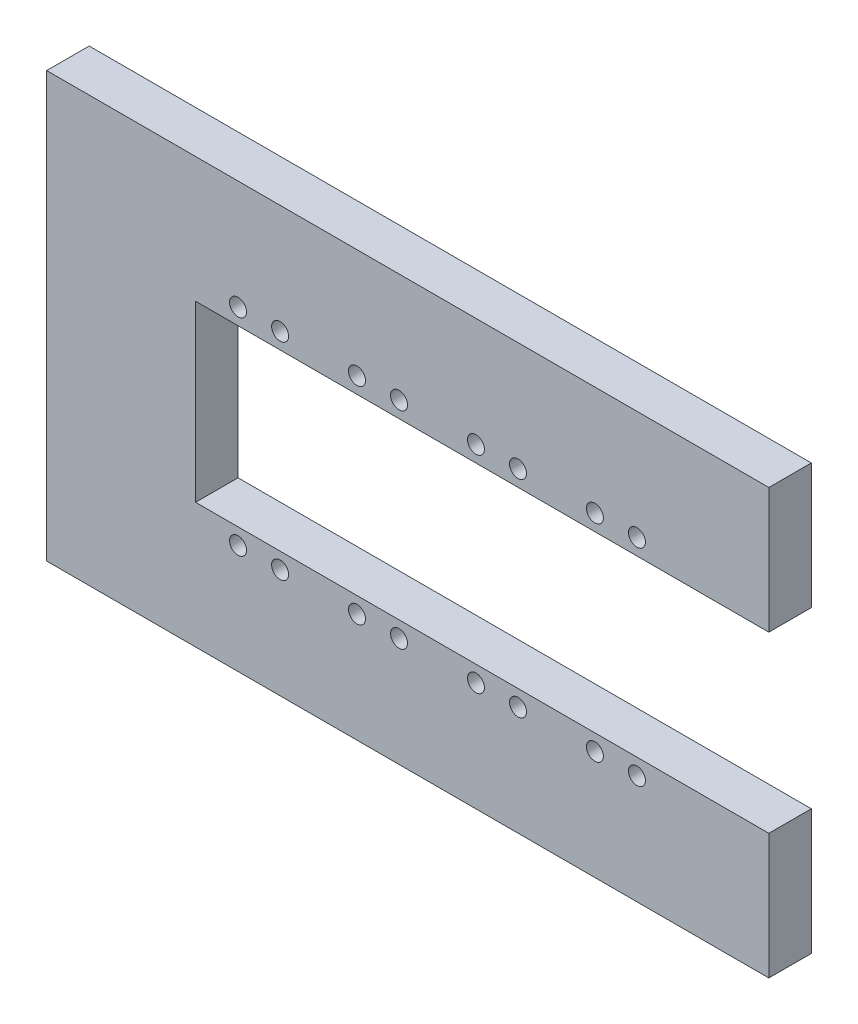
ISO-10303-21;
HEADER;
FILE_DESCRIPTION(('STEP AP214'),'2;1');
FILE_NAME('part.step','',(''),(''),'','','');
FILE_SCHEMA(('AUTOMOTIVE_DESIGN { 1 0 10303 214 1 1 1 1 }'));
ENDSEC;
DATA;
#1=APPLICATION_CONTEXT('core data for automotive mechanical design processes');
#2=APPLICATION_PROTOCOL_DEFINITION('international standard','automotive_design',2000,#1);
#3=PRODUCT_CONTEXT('',#1,'mechanical');
#4=PRODUCT('Part','Part','',(#3));
#5=PRODUCT_RELATED_PRODUCT_CATEGORY('part','',(#4));
#6=PRODUCT_DEFINITION_FORMATION('','',#4);
#7=PRODUCT_DEFINITION_CONTEXT('part definition',#1,'design');
#8=PRODUCT_DEFINITION('design','',#6,#7);
#9=PRODUCT_DEFINITION_SHAPE('','',#8);
#10=(LENGTH_UNIT() NAMED_UNIT(*) SI_UNIT(.MILLI.,.METRE.));
#11=(NAMED_UNIT(*) PLANE_ANGLE_UNIT() SI_UNIT($,.RADIAN.));
#12=(NAMED_UNIT(*) SI_UNIT($,.STERADIAN.) SOLID_ANGLE_UNIT());
#13=UNCERTAINTY_MEASURE_WITH_UNIT(LENGTH_MEASURE(1.E-05),#10,'distance_accuracy_value','');
#14=(GEOMETRIC_REPRESENTATION_CONTEXT(3) GLOBAL_UNCERTAINTY_ASSIGNED_CONTEXT((#13)) GLOBAL_UNIT_ASSIGNED_CONTEXT((#10,
#11,#12)) REPRESENTATION_CONTEXT('',''));
#15=CARTESIAN_POINT('',(0.,0.,0.));
#16=DIRECTION('',(0.,0.,1.));
#17=DIRECTION('',(1.,0.,0.));
#18=AXIS2_PLACEMENT_3D('',#15,#16,#17);
#19=CARTESIAN_POINT('',(120.,50.,-10.));
#20=DIRECTION('',(1.,0.,0.));
#21=DIRECTION('',(0.,0.,-1.));
#22=AXIS2_PLACEMENT_3D('',#19,#20,#21);
#23=PLANE('',#22);
#24=DIRECTION('',(0.,0.,1.));
#25=VECTOR('',#24,1.);
#26=CARTESIAN_POINT('',(120.,20.5,-10.));
#27=LINE('',#26,#25);
#28=CARTESIAN_POINT('',(120.,20.5,-10.));
#29=VERTEX_POINT('',#28);
#30=CARTESIAN_POINT('',(120.,20.5,0.));
#31=VERTEX_POINT('',#30);
#32=EDGE_CURVE('E141',#29,#31,#27,.T.);
#33=ORIENTED_EDGE('',*,*,#32,.F.);
#34=DIRECTION('',(0.,1.,0.));
#35=VECTOR('',#34,1.);
#36=CARTESIAN_POINT('',(120.,50.,-10.));
#37=LINE('',#36,#35);
#38=CARTESIAN_POINT('',(120.,50.,-10.));
#39=VERTEX_POINT('',#38);
#40=EDGE_CURVE('E197',#29,#39,#37,.T.);
#41=ORIENTED_EDGE('',*,*,#40,.T.);
#42=DIRECTION('',(0.,0.,1.));
#43=VECTOR('',#42,1.);
#44=CARTESIAN_POINT('',(120.,50.,-10.));
#45=LINE('',#44,#43);
#46=CARTESIAN_POINT('',(120.,50.,0.));
#47=VERTEX_POINT('',#46);
#48=EDGE_CURVE('E215',#39,#47,#45,.T.);
#49=ORIENTED_EDGE('',*,*,#48,.T.);
#50=DIRECTION('',(0.,1.,0.));
#51=VECTOR('',#50,1.);
#52=CARTESIAN_POINT('',(120.,50.,0.));
#53=LINE('',#52,#51);
#54=EDGE_CURVE('E207',#31,#47,#53,.T.);
#55=ORIENTED_EDGE('',*,*,#54,.F.);
#56=EDGE_LOOP('',(#33,#41,#49,#55));
#57=FACE_BOUND('',#56,.T.);
#58=ADVANCED_FACE('F35',(#57),#23,.T.);
#59=CARTESIAN_POINT('',(79.05,24.3,-10.));
#60=DIRECTION('',(0.,0.,1.));
#61=DIRECTION('',(1.,0.,0.));
#62=AXIS2_PLACEMENT_3D('',#59,#60,#61);
#63=CYLINDRICAL_SURFACE('',#62,2.);
#64=CARTESIAN_POINT('',(79.05,24.3,-10.));
#65=DIRECTION('',(0.,0.,1.));
#66=DIRECTION('',(1.,0.,0.));
#67=AXIS2_PLACEMENT_3D('',#64,#65,#66);
#68=CIRCLE('',#67,2.);
#69=CARTESIAN_POINT('',(81.05,24.3,-10.));
#70=VERTEX_POINT('',#69);
#71=EDGE_CURVE('E43',#70,#70,#68,.T.);
#72=ORIENTED_EDGE('',*,*,#71,.F.);
#73=EDGE_LOOP('',(#72));
#74=FACE_BOUND('',#73,.T.);
#75=CARTESIAN_POINT('',(79.05,24.3,0.));
#76=DIRECTION('',(0.,0.,1.));
#77=DIRECTION('',(1.,0.,0.));
#78=AXIS2_PLACEMENT_3D('',#75,#76,#77);
#79=CIRCLE('',#78,2.);
#80=CARTESIAN_POINT('',(81.05,24.3,0.));
#81=VERTEX_POINT('',#80);
#82=EDGE_CURVE('E11',#81,#81,#79,.T.);
#83=ORIENTED_EDGE('',*,*,#82,.T.);
#84=EDGE_LOOP('',(#83));
#85=FACE_BOUND('',#84,.T.);
#86=ADVANCED_FACE('F37',(#74,#85),#63,.F.);
#87=CARTESIAN_POINT('',(51.05,24.3,-10.));
#88=DIRECTION('',(0.,0.,1.));
#89=DIRECTION('',(1.,0.,0.));
#90=AXIS2_PLACEMENT_3D('',#87,#88,#89);
#91=CYLINDRICAL_SURFACE('',#90,2.);
#92=CARTESIAN_POINT('',(51.05,24.3,-10.));
#93=DIRECTION('',(0.,0.,1.));
#94=DIRECTION('',(1.,0.,0.));
#95=AXIS2_PLACEMENT_3D('',#92,#93,#94);
#96=CIRCLE('',#95,2.);
#97=CARTESIAN_POINT('',(53.05,24.3,-10.));
#98=VERTEX_POINT('',#97);
#99=EDGE_CURVE('E256',#98,#98,#96,.T.);
#100=ORIENTED_EDGE('',*,*,#99,.F.);
#101=EDGE_LOOP('',(#100));
#102=FACE_BOUND('',#101,.T.);
#103=CARTESIAN_POINT('',(51.05,24.3,0.));
#104=DIRECTION('',(0.,0.,1.));
#105=DIRECTION('',(1.,0.,0.));
#106=AXIS2_PLACEMENT_3D('',#103,#104,#105);
#107=CIRCLE('',#106,2.);
#108=CARTESIAN_POINT('',(53.05,24.3,0.));
#109=VERTEX_POINT('',#108);
#110=EDGE_CURVE('E259',#109,#109,#107,.T.);
#111=ORIENTED_EDGE('',*,*,#110,.T.);
#112=EDGE_LOOP('',(#111));
#113=FACE_BOUND('',#112,.T.);
#114=ADVANCED_FACE('F267',(#102,#113),#91,.F.);
#115=CARTESIAN_POINT('',(79.05,-24.3,-10.));
#116=DIRECTION('',(0.,0.,1.));
#117=DIRECTION('',(1.,0.,0.));
#118=AXIS2_PLACEMENT_3D('',#115,#116,#117);
#119=CYLINDRICAL_SURFACE('',#118,2.);
#120=CARTESIAN_POINT('',(79.05,-24.3,-10.));
#121=DIRECTION('',(0.,0.,1.));
#122=DIRECTION('',(-1.,0.,0.));
#123=AXIS2_PLACEMENT_3D('',#120,#121,#122);
#124=CIRCLE('',#123,2.);
#125=CARTESIAN_POINT('',(77.05,-24.3,-10.));
#126=VERTEX_POINT('',#125);
#127=EDGE_CURVE('E250',#126,#126,#124,.T.);
#128=ORIENTED_EDGE('',*,*,#127,.F.);
#129=EDGE_LOOP('',(#128));
#130=FACE_BOUND('',#129,.T.);
#131=CARTESIAN_POINT('',(79.05,-24.3,0.));
#132=DIRECTION('',(0.,0.,1.));
#133=DIRECTION('',(-1.,0.,0.));
#134=AXIS2_PLACEMENT_3D('',#131,#132,#133);
#135=CIRCLE('',#134,2.);
#136=CARTESIAN_POINT('',(77.05,-24.3,0.));
#137=VERTEX_POINT('',#136);
#138=EDGE_CURVE('E253',#137,#137,#135,.T.);
#139=ORIENTED_EDGE('',*,*,#138,.T.);
#140=EDGE_LOOP('',(#139));
#141=FACE_BOUND('',#140,.T.);
#142=ADVANCED_FACE('F373',(#130,#141),#119,.F.);
#143=CARTESIAN_POINT('',(51.05,-24.3,-10.));
#144=DIRECTION('',(0.,0.,1.));
#145=DIRECTION('',(1.,0.,0.));
#146=AXIS2_PLACEMENT_3D('',#143,#144,#145);
#147=CYLINDRICAL_SURFACE('',#146,2.);
#148=CARTESIAN_POINT('',(51.05,-24.3,-10.));
#149=DIRECTION('',(0.,0.,1.));
#150=DIRECTION('',(-1.,0.,0.));
#151=AXIS2_PLACEMENT_3D('',#148,#149,#150);
#152=CIRCLE('',#151,2.);
#153=CARTESIAN_POINT('',(49.05,-24.3,-10.));
#154=VERTEX_POINT('',#153);
#155=EDGE_CURVE('E244',#154,#154,#152,.T.);
#156=ORIENTED_EDGE('',*,*,#155,.F.);
#157=EDGE_LOOP('',(#156));
#158=FACE_BOUND('',#157,.T.);
#159=CARTESIAN_POINT('',(51.05,-24.3,0.));
#160=DIRECTION('',(0.,0.,1.));
#161=DIRECTION('',(-1.,0.,0.));
#162=AXIS2_PLACEMENT_3D('',#159,#160,#161);
#163=CIRCLE('',#162,2.);
#164=CARTESIAN_POINT('',(49.05,-24.3,0.));
#165=VERTEX_POINT('',#164);
#166=EDGE_CURVE('E247',#165,#165,#163,.T.);
#167=ORIENTED_EDGE('',*,*,#166,.T.);
#168=EDGE_LOOP('',(#167));
#169=FACE_BOUND('',#168,.T.);
#170=ADVANCED_FACE('F378',(#158,#169),#147,.F.);
#171=CARTESIAN_POINT('',(88.95,-24.3,-10.));
#172=DIRECTION('',(0.,0.,1.));
#173=DIRECTION('',(1.,0.,0.));
#174=AXIS2_PLACEMENT_3D('',#171,#172,#173);
#175=CYLINDRICAL_SURFACE('',#174,2.);
#176=CARTESIAN_POINT('',(88.95,-24.3,-10.));
#177=DIRECTION('',(0.,0.,1.));
#178=DIRECTION('',(1.,0.,0.));
#179=AXIS2_PLACEMENT_3D('',#176,#177,#178);
#180=CIRCLE('',#179,2.);
#181=CARTESIAN_POINT('',(90.95,-24.3,-10.));
#182=VERTEX_POINT('',#181);
#183=EDGE_CURVE('E238',#182,#182,#180,.T.);
#184=ORIENTED_EDGE('',*,*,#183,.F.);
#185=EDGE_LOOP('',(#184));
#186=FACE_BOUND('',#185,.T.);
#187=CARTESIAN_POINT('',(88.95,-24.3,0.));
#188=DIRECTION('',(0.,0.,1.));
#189=DIRECTION('',(1.,0.,0.));
#190=AXIS2_PLACEMENT_3D('',#187,#188,#189);
#191=CIRCLE('',#190,2.);
#192=CARTESIAN_POINT('',(90.95,-24.3,0.));
#193=VERTEX_POINT('',#192);
#194=EDGE_CURVE('E241',#193,#193,#191,.T.);
#195=ORIENTED_EDGE('',*,*,#194,.T.);
#196=EDGE_LOOP('',(#195));
#197=FACE_BOUND('',#196,.T.);
#198=ADVANCED_FACE('F385',(#186,#197),#175,.F.);
#199=CARTESIAN_POINT('',(60.95,-24.3,-10.));
#200=DIRECTION('',(0.,0.,1.));
#201=DIRECTION('',(1.,0.,0.));
#202=AXIS2_PLACEMENT_3D('',#199,#200,#201);
#203=CYLINDRICAL_SURFACE('',#202,2.);
#204=CARTESIAN_POINT('',(60.95,-24.3,-10.));
#205=DIRECTION('',(0.,0.,1.));
#206=DIRECTION('',(1.,0.,0.));
#207=AXIS2_PLACEMENT_3D('',#204,#205,#206);
#208=CIRCLE('',#207,2.);
#209=CARTESIAN_POINT('',(62.95,-24.3,-10.));
#210=VERTEX_POINT('',#209);
#211=EDGE_CURVE('E232',#210,#210,#208,.T.);
#212=ORIENTED_EDGE('',*,*,#211,.F.);
#213=EDGE_LOOP('',(#212));
#214=FACE_BOUND('',#213,.T.);
#215=CARTESIAN_POINT('',(60.95,-24.3,0.));
#216=DIRECTION('',(0.,0.,1.));
#217=DIRECTION('',(1.,0.,0.));
#218=AXIS2_PLACEMENT_3D('',#215,#216,#217);
#219=CIRCLE('',#218,2.);
#220=CARTESIAN_POINT('',(62.95,-24.3,0.));
#221=VERTEX_POINT('',#220);
#222=EDGE_CURVE('E235',#221,#221,#219,.T.);
#223=ORIENTED_EDGE('',*,*,#222,.T.);
#224=EDGE_LOOP('',(#223));
#225=FACE_BOUND('',#224,.T.);
#226=ADVANCED_FACE('F389',(#214,#225),#203,.F.);
#227=CARTESIAN_POINT('',(88.95,24.3,-10.));
#228=DIRECTION('',(0.,0.,1.));
#229=DIRECTION('',(1.,0.,0.));
#230=AXIS2_PLACEMENT_3D('',#227,#228,#229);
#231=CYLINDRICAL_SURFACE('',#230,2.);
#232=CARTESIAN_POINT('',(88.95,24.3,-10.));
#233=DIRECTION('',(0.,0.,1.));
#234=DIRECTION('',(-1.,0.,0.));
#235=AXIS2_PLACEMENT_3D('',#232,#233,#234);
#236=CIRCLE('',#235,2.);
#237=CARTESIAN_POINT('',(86.95,24.3,-10.));
#238=VERTEX_POINT('',#237);
#239=EDGE_CURVE('E226',#238,#238,#236,.T.);
#240=ORIENTED_EDGE('',*,*,#239,.F.);
#241=EDGE_LOOP('',(#240));
#242=FACE_BOUND('',#241,.T.);
#243=CARTESIAN_POINT('',(88.95,24.3,0.));
#244=DIRECTION('',(0.,0.,1.));
#245=DIRECTION('',(-1.,0.,0.));
#246=AXIS2_PLACEMENT_3D('',#243,#244,#245);
#247=CIRCLE('',#246,2.);
#248=CARTESIAN_POINT('',(86.95,24.3,0.));
#249=VERTEX_POINT('',#248);
#250=EDGE_CURVE('E229',#249,#249,#247,.T.);
#251=ORIENTED_EDGE('',*,*,#250,.T.);
#252=EDGE_LOOP('',(#251));
#253=FACE_BOUND('',#252,.T.);
#254=ADVANCED_FACE('F393',(#242,#253),#231,.F.);
#255=CARTESIAN_POINT('',(60.95,24.3,-10.));
#256=DIRECTION('',(0.,0.,1.));
#257=DIRECTION('',(1.,0.,0.));
#258=AXIS2_PLACEMENT_3D('',#255,#256,#257);
#259=CYLINDRICAL_SURFACE('',#258,2.);
#260=CARTESIAN_POINT('',(60.95,24.3,-10.));
#261=DIRECTION('',(0.,0.,1.));
#262=DIRECTION('',(-1.,0.,0.));
#263=AXIS2_PLACEMENT_3D('',#260,#261,#262);
#264=CIRCLE('',#263,2.);
#265=CARTESIAN_POINT('',(58.95,24.3,-10.));
#266=VERTEX_POINT('',#265);
#267=EDGE_CURVE('E214',#266,#266,#264,.T.);
#268=ORIENTED_EDGE('',*,*,#267,.F.);
#269=EDGE_LOOP('',(#268));
#270=FACE_BOUND('',#269,.T.);
#271=CARTESIAN_POINT('',(60.95,24.3,0.));
#272=DIRECTION('',(0.,0.,1.));
#273=DIRECTION('',(-1.,0.,0.));
#274=AXIS2_PLACEMENT_3D('',#271,#272,#273);
#275=CIRCLE('',#274,2.);
#276=CARTESIAN_POINT('',(58.95,24.3,0.));
#277=VERTEX_POINT('',#276);
#278=EDGE_CURVE('E223',#277,#277,#275,.T.);
#279=ORIENTED_EDGE('',*,*,#278,.T.);
#280=EDGE_LOOP('',(#279));
#281=FACE_BOUND('',#280,.T.);
#282=ADVANCED_FACE('F397',(#270,#281),#259,.F.);
#283=CARTESIAN_POINT('',(-50.,50.,-10.));
#284=DIRECTION('',(-1.,0.,0.));
#285=DIRECTION('',(0.,0.,1.));
#286=AXIS2_PLACEMENT_3D('',#283,#284,#285);
#287=PLANE('',#286);
#288=DIRECTION('',(0.,-1.,0.));
#289=VECTOR('',#288,1.);
#290=CARTESIAN_POINT('',(-50.,50.,0.));
#291=LINE('',#290,#289);
#292=CARTESIAN_POINT('',(-50.,50.,0.));
#293=VERTEX_POINT('',#292);
#294=CARTESIAN_POINT('',(-50.,-50.,0.));
#295=VERTEX_POINT('',#294);
#296=EDGE_CURVE('E189',#293,#295,#291,.T.);
#297=ORIENTED_EDGE('',*,*,#296,.F.);
#298=DIRECTION('',(0.,0.,1.));
#299=VECTOR('',#298,1.);
#300=CARTESIAN_POINT('',(-50.,50.,-10.));
#301=LINE('',#300,#299);
#302=CARTESIAN_POINT('',(-50.,50.,-10.));
#303=VERTEX_POINT('',#302);
#304=EDGE_CURVE('E59',#303,#293,#301,.T.);
#305=ORIENTED_EDGE('',*,*,#304,.F.);
#306=DIRECTION('',(0.,-1.,0.));
#307=VECTOR('',#306,1.);
#308=CARTESIAN_POINT('',(-50.,50.,-10.));
#309=LINE('',#308,#307);
#310=CARTESIAN_POINT('',(-50.,-50.,-10.));
#311=VERTEX_POINT('',#310);
#312=EDGE_CURVE('E192',#303,#311,#309,.T.);
#313=ORIENTED_EDGE('',*,*,#312,.T.);
#314=DIRECTION('',(0.,0.,1.));
#315=VECTOR('',#314,1.);
#316=CARTESIAN_POINT('',(-50.,-50.,-10.));
#317=LINE('',#316,#315);
#318=EDGE_CURVE('E85',#311,#295,#317,.T.);
#319=ORIENTED_EDGE('',*,*,#318,.T.);
#320=EDGE_LOOP('',(#297,#305,#313,#319));
#321=FACE_BOUND('',#320,.T.);
#322=ADVANCED_FACE('F303',(#321),#287,.T.);
#323=CARTESIAN_POINT('',(-50.,50.,-10.));
#324=DIRECTION('',(0.,1.,0.));
#325=DIRECTION('',(0.,0.,1.));
#326=AXIS2_PLACEMENT_3D('',#323,#324,#325);
#327=PLANE('',#326);
#328=DIRECTION('',(-1.,0.,0.));
#329=VECTOR('',#328,1.);
#330=CARTESIAN_POINT('',(-50.,50.,0.));
#331=LINE('',#330,#329);
#332=EDGE_CURVE('E195',#47,#293,#331,.T.);
#333=ORIENTED_EDGE('',*,*,#332,.F.);
#334=ORIENTED_EDGE('',*,*,#48,.F.);
#335=DIRECTION('',(-1.,0.,0.));
#336=VECTOR('',#335,1.);
#337=CARTESIAN_POINT('',(-50.,50.,-10.));
#338=LINE('',#337,#336);
#339=EDGE_CURVE('E200',#39,#303,#338,.T.);
#340=ORIENTED_EDGE('',*,*,#339,.T.);
#341=ORIENTED_EDGE('',*,*,#304,.T.);
#342=EDGE_LOOP('',(#333,#334,#340,#341));
#343=FACE_BOUND('',#342,.T.);
#344=ADVANCED_FACE('F297',(#343),#327,.T.);
#345=DIRECTION('',(0.,0.,1.));
#346=VECTOR('',#345,1.);
#347=CARTESIAN_POINT('',(120.,-20.5,-10.));
#348=LINE('',#347,#346);
#349=CARTESIAN_POINT('',(120.,-20.5,-10.));
#350=VERTEX_POINT('',#349);
#351=CARTESIAN_POINT('',(120.,-20.5,0.));
#352=VERTEX_POINT('',#351);
#353=EDGE_CURVE('E115',#350,#352,#348,.T.);
#354=ORIENTED_EDGE('',*,*,#353,.T.);
#355=CARTESIAN_POINT('',(120.,-50.,0.));
#356=VERTEX_POINT('',#355);
#357=EDGE_CURVE('E208',#356,#352,#53,.T.);
#358=ORIENTED_EDGE('',*,*,#357,.F.);
#359=DIRECTION('',(0.,0.,1.));
#360=VECTOR('',#359,1.);
#361=CARTESIAN_POINT('',(120.,-50.,-10.));
#362=LINE('',#361,#360);
#363=CARTESIAN_POINT('',(120.,-50.,-10.));
#364=VERTEX_POINT('',#363);
#365=EDGE_CURVE('E218',#364,#356,#362,.T.);
#366=ORIENTED_EDGE('',*,*,#365,.F.);
#367=EDGE_CURVE('E198',#364,#350,#37,.T.);
#368=ORIENTED_EDGE('',*,*,#367,.T.);
#369=EDGE_LOOP('',(#354,#358,#366,#368));
#370=FACE_BOUND('',#369,.T.);
#371=ADVANCED_FACE('F291',(#370),#23,.T.);
#372=CARTESIAN_POINT('',(-50.,-50.,-10.));
#373=DIRECTION('',(0.,-1.,0.));
#374=DIRECTION('',(0.,0.,-1.));
#375=AXIS2_PLACEMENT_3D('',#372,#373,#374);
#376=PLANE('',#375);
#377=DIRECTION('',(1.,0.,0.));
#378=VECTOR('',#377,1.);
#379=CARTESIAN_POINT('',(-50.,-50.,0.));
#380=LINE('',#379,#378);
#381=EDGE_CURVE('E204',#295,#356,#380,.T.);
#382=ORIENTED_EDGE('',*,*,#381,.F.);
#383=ORIENTED_EDGE('',*,*,#318,.F.);
#384=DIRECTION('',(1.,0.,0.));
#385=VECTOR('',#384,1.);
#386=CARTESIAN_POINT('',(-50.,-50.,-10.));
#387=LINE('',#386,#385);
#388=EDGE_CURVE('E194',#311,#364,#387,.T.);
#389=ORIENTED_EDGE('',*,*,#388,.T.);
#390=ORIENTED_EDGE('',*,*,#365,.T.);
#391=EDGE_LOOP('',(#382,#383,#389,#390));
#392=FACE_BOUND('',#391,.T.);
#393=ADVANCED_FACE('F282',(#392),#376,.T.);
#394=CARTESIAN_POINT('',(0.,0.,-10.));
#395=DIRECTION('',(0.,0.,1.));
#396=DIRECTION('',(1.,0.,0.));
#397=AXIS2_PLACEMENT_3D('',#394,#395,#396);
#398=PLANE('',#397);
#399=CARTESIAN_POINT('',(23.05,24.3,-10.));
#400=DIRECTION('',(0.,0.,1.));
#401=DIRECTION('',(1.,0.,0.));
#402=AXIS2_PLACEMENT_3D('',#399,#400,#401);
#403=CIRCLE('',#402,2.);
#404=CARTESIAN_POINT('',(25.05,24.3,-10.));
#405=VERTEX_POINT('',#404);
#406=EDGE_CURVE('E140',#405,#405,#403,.T.);
#407=ORIENTED_EDGE('',*,*,#406,.T.);
#408=EDGE_LOOP('',(#407));
#409=FACE_BOUND('',#408,.T.);
#410=CARTESIAN_POINT('',(23.05,-24.3,-10.));
#411=DIRECTION('',(0.,0.,1.));
#412=DIRECTION('',(-1.,0.,0.));
#413=AXIS2_PLACEMENT_3D('',#410,#411,#412);
#414=CIRCLE('',#413,2.);
#415=CARTESIAN_POINT('',(21.05,-24.3,-10.));
#416=VERTEX_POINT('',#415);
#417=EDGE_CURVE('E149',#416,#416,#414,.T.);
#418=ORIENTED_EDGE('',*,*,#417,.T.);
#419=EDGE_LOOP('',(#418));
#420=FACE_BOUND('',#419,.T.);
#421=CARTESIAN_POINT('',(32.95,-24.3,-10.));
#422=DIRECTION('',(0.,0.,1.));
#423=DIRECTION('',(1.,0.,0.));
#424=AXIS2_PLACEMENT_3D('',#421,#422,#423);
#425=CIRCLE('',#424,2.);
#426=CARTESIAN_POINT('',(34.95,-24.3,-10.));
#427=VERTEX_POINT('',#426);
#428=EDGE_CURVE('E155',#427,#427,#425,.T.);
#429=ORIENTED_EDGE('',*,*,#428,.T.);
#430=EDGE_LOOP('',(#429));
#431=FACE_BOUND('',#430,.T.);
#432=CARTESIAN_POINT('',(32.95,24.3,-10.));
#433=DIRECTION('',(0.,0.,1.));
#434=DIRECTION('',(-1.,0.,0.));
#435=AXIS2_PLACEMENT_3D('',#432,#433,#434);
#436=CIRCLE('',#435,2.);
#437=CARTESIAN_POINT('',(30.95,24.3,-10.));
#438=VERTEX_POINT('',#437);
#439=EDGE_CURVE('E161',#438,#438,#436,.T.);
#440=ORIENTED_EDGE('',*,*,#439,.T.);
#441=EDGE_LOOP('',(#440));
#442=FACE_BOUND('',#441,.T.);
#443=CARTESIAN_POINT('',(4.95,24.3,-10.));
#444=DIRECTION('',(0.,0.,1.));
#445=DIRECTION('',(-1.,0.,0.));
#446=AXIS2_PLACEMENT_3D('',#443,#444,#445);
#447=CIRCLE('',#446,2.);
#448=CARTESIAN_POINT('',(2.95,24.3,-10.));
#449=VERTEX_POINT('',#448);
#450=EDGE_CURVE('E181',#449,#449,#447,.T.);
#451=ORIENTED_EDGE('',*,*,#450,.T.);
#452=EDGE_LOOP('',(#451));
#453=FACE_BOUND('',#452,.T.);
#454=CARTESIAN_POINT('',(-4.95,24.3,-10.));
#455=DIRECTION('',(0.,0.,1.));
#456=DIRECTION('',(1.,0.,0.));
#457=AXIS2_PLACEMENT_3D('',#454,#455,#456);
#458=CIRCLE('',#457,2.);
#459=CARTESIAN_POINT('',(-2.95,24.3,-10.));
#460=VERTEX_POINT('',#459);
#461=EDGE_CURVE('E175',#460,#460,#458,.T.);
#462=ORIENTED_EDGE('',*,*,#461,.T.);
#463=EDGE_LOOP('',(#462));
#464=FACE_BOUND('',#463,.T.);
#465=CARTESIAN_POINT('',(-4.95,-24.3,-10.));
#466=DIRECTION('',(0.,0.,1.));
#467=DIRECTION('',(-1.,0.,0.));
#468=AXIS2_PLACEMENT_3D('',#465,#466,#467);
#469=CIRCLE('',#468,2.);
#470=CARTESIAN_POINT('',(-6.95,-24.3,-10.));
#471=VERTEX_POINT('',#470);
#472=EDGE_CURVE('E168',#471,#471,#469,.T.);
#473=ORIENTED_EDGE('',*,*,#472,.T.);
#474=EDGE_LOOP('',(#473));
#475=FACE_BOUND('',#474,.T.);
#476=CARTESIAN_POINT('',(4.95,-24.3,-10.));
#477=DIRECTION('',(0.,0.,1.));
#478=DIRECTION('',(1.,0.,0.));
#479=AXIS2_PLACEMENT_3D('',#476,#477,#478);
#480=CIRCLE('',#479,2.);
#481=CARTESIAN_POINT('',(6.95,-24.3,-10.));
#482=VERTEX_POINT('',#481);
#483=EDGE_CURVE('E186',#482,#482,#480,.T.);
#484=ORIENTED_EDGE('',*,*,#483,.T.);
#485=EDGE_LOOP('',(#484));
#486=FACE_BOUND('',#485,.T.);
#487=ORIENTED_EDGE('',*,*,#40,.F.);
#488=DIRECTION('',(-1.,0.,0.));
#489=VECTOR('',#488,1.);
#490=CARTESIAN_POINT('',(-14.95,20.5,-10.));
#491=LINE('',#490,#489);
#492=CARTESIAN_POINT('',(-14.95,20.5,-10.));
#493=VERTEX_POINT('',#492);
#494=EDGE_CURVE('E116',#29,#493,#491,.T.);
#495=ORIENTED_EDGE('',*,*,#494,.T.);
#496=DIRECTION('',(0.,-1.,0.));
#497=VECTOR('',#496,1.);
#498=CARTESIAN_POINT('',(-14.95,20.5,-10.));
#499=LINE('',#498,#497);
#500=CARTESIAN_POINT('',(-14.95,-20.5,-10.));
#501=VERTEX_POINT('',#500);
#502=EDGE_CURVE('E111',#493,#501,#499,.T.);
#503=ORIENTED_EDGE('',*,*,#502,.T.);
#504=DIRECTION('',(1.,0.,0.));
#505=VECTOR('',#504,1.);
#506=CARTESIAN_POINT('',(-14.95,-20.5,-10.));
#507=LINE('',#506,#505);
#508=EDGE_CURVE('E119',#501,#350,#507,.T.);
#509=ORIENTED_EDGE('',*,*,#508,.T.);
#510=ORIENTED_EDGE('',*,*,#367,.F.);
#511=ORIENTED_EDGE('',*,*,#388,.F.);
#512=ORIENTED_EDGE('',*,*,#312,.F.);
#513=ORIENTED_EDGE('',*,*,#339,.F.);
#514=EDGE_LOOP('',(#487,#495,#503,#509,#510,#511,#512,#513));
#515=FACE_BOUND('',#514,.T.);
#516=ORIENTED_EDGE('',*,*,#267,.T.);
#517=EDGE_LOOP('',(#516));
#518=FACE_BOUND('',#517,.T.);
#519=ORIENTED_EDGE('',*,*,#239,.T.);
#520=EDGE_LOOP('',(#519));
#521=FACE_BOUND('',#520,.T.);
#522=ORIENTED_EDGE('',*,*,#211,.T.);
#523=EDGE_LOOP('',(#522));
#524=FACE_BOUND('',#523,.T.);
#525=ORIENTED_EDGE('',*,*,#183,.T.);
#526=EDGE_LOOP('',(#525));
#527=FACE_BOUND('',#526,.T.);
#528=ORIENTED_EDGE('',*,*,#155,.T.);
#529=EDGE_LOOP('',(#528));
#530=FACE_BOUND('',#529,.T.);
#531=ORIENTED_EDGE('',*,*,#127,.T.);
#532=EDGE_LOOP('',(#531));
#533=FACE_BOUND('',#532,.T.);
#534=ORIENTED_EDGE('',*,*,#99,.T.);
#535=EDGE_LOOP('',(#534));
#536=FACE_BOUND('',#535,.T.);
#537=ORIENTED_EDGE('',*,*,#71,.T.);
#538=EDGE_LOOP('',(#537));
#539=FACE_BOUND('',#538,.T.);
#540=ADVANCED_FACE('F127',(#409,#420,#431,#442,#453,#464,#475,#486,#515,#518,#521,#524,#527,
#530,#533,#536,#539),#398,.F.);
#541=CARTESIAN_POINT('',(0.,0.,0.));
#542=DIRECTION('',(0.,0.,1.));
#543=DIRECTION('',(1.,0.,0.));
#544=AXIS2_PLACEMENT_3D('',#541,#542,#543);
#545=PLANE('',#544);
#546=DIRECTION('',(-1.,0.,0.));
#547=VECTOR('',#546,1.);
#548=CARTESIAN_POINT('',(-14.95,20.5,0.));
#549=LINE('',#548,#547);
#550=CARTESIAN_POINT('',(-14.95,20.5,0.));
#551=VERTEX_POINT('',#550);
#552=EDGE_CURVE('E129',#31,#551,#549,.T.);
#553=ORIENTED_EDGE('',*,*,#552,.F.);
#554=ORIENTED_EDGE('',*,*,#54,.T.);
#555=ORIENTED_EDGE('',*,*,#332,.T.);
#556=ORIENTED_EDGE('',*,*,#296,.T.);
#557=ORIENTED_EDGE('',*,*,#381,.T.);
#558=ORIENTED_EDGE('',*,*,#357,.T.);
#559=DIRECTION('',(1.,0.,0.));
#560=VECTOR('',#559,1.);
#561=CARTESIAN_POINT('',(-14.95,-20.5,0.));
#562=LINE('',#561,#560);
#563=CARTESIAN_POINT('',(-14.95,-20.5,0.));
#564=VERTEX_POINT('',#563);
#565=EDGE_CURVE('E132',#564,#352,#562,.T.);
#566=ORIENTED_EDGE('',*,*,#565,.F.);
#567=DIRECTION('',(0.,-1.,0.));
#568=VECTOR('',#567,1.);
#569=CARTESIAN_POINT('',(-14.95,20.5,0.));
#570=LINE('',#569,#568);
#571=EDGE_CURVE('E50',#551,#564,#570,.T.);
#572=ORIENTED_EDGE('',*,*,#571,.F.);
#573=EDGE_LOOP('',(#553,#554,#555,#556,#557,#558,#566,#572));
#574=FACE_BOUND('',#573,.T.);
#575=CARTESIAN_POINT('',(23.05,24.3,0.));
#576=DIRECTION('',(0.,0.,1.));
#577=DIRECTION('',(1.,0.,0.));
#578=AXIS2_PLACEMENT_3D('',#575,#576,#577);
#579=CIRCLE('',#578,2.);
#580=CARTESIAN_POINT('',(25.05,24.3,0.));
#581=VERTEX_POINT('',#580);
#582=EDGE_CURVE('E146',#581,#581,#579,.T.);
#583=ORIENTED_EDGE('',*,*,#582,.F.);
#584=EDGE_LOOP('',(#583));
#585=FACE_BOUND('',#584,.T.);
#586=CARTESIAN_POINT('',(23.05,-24.3,0.));
#587=DIRECTION('',(0.,0.,1.));
#588=DIRECTION('',(-1.,0.,0.));
#589=AXIS2_PLACEMENT_3D('',#586,#587,#588);
#590=CIRCLE('',#589,2.);
#591=CARTESIAN_POINT('',(21.05,-24.3,0.));
#592=VERTEX_POINT('',#591);
#593=EDGE_CURVE('E152',#592,#592,#590,.T.);
#594=ORIENTED_EDGE('',*,*,#593,.F.);
#595=EDGE_LOOP('',(#594));
#596=FACE_BOUND('',#595,.T.);
#597=CARTESIAN_POINT('',(32.95,-24.3,0.));
#598=DIRECTION('',(0.,0.,1.));
#599=DIRECTION('',(1.,0.,0.));
#600=AXIS2_PLACEMENT_3D('',#597,#598,#599);
#601=CIRCLE('',#600,2.);
#602=CARTESIAN_POINT('',(34.95,-24.3,0.));
#603=VERTEX_POINT('',#602);
#604=EDGE_CURVE('E158',#603,#603,#601,.T.);
#605=ORIENTED_EDGE('',*,*,#604,.F.);
#606=EDGE_LOOP('',(#605));
#607=FACE_BOUND('',#606,.T.);
#608=CARTESIAN_POINT('',(32.95,24.3,0.));
#609=DIRECTION('',(0.,0.,1.));
#610=DIRECTION('',(-1.,0.,0.));
#611=AXIS2_PLACEMENT_3D('',#608,#609,#610);
#612=CIRCLE('',#611,2.);
#613=CARTESIAN_POINT('',(30.95,24.3,0.));
#614=VERTEX_POINT('',#613);
#615=EDGE_CURVE('E164',#614,#614,#612,.T.);
#616=ORIENTED_EDGE('',*,*,#615,.F.);
#617=EDGE_LOOP('',(#616));
#618=FACE_BOUND('',#617,.T.);
#619=CARTESIAN_POINT('',(4.95,24.3,0.));
#620=DIRECTION('',(0.,0.,1.));
#621=DIRECTION('',(-1.,0.,0.));
#622=AXIS2_PLACEMENT_3D('',#619,#620,#621);
#623=CIRCLE('',#622,2.);
#624=CARTESIAN_POINT('',(2.95,24.3,0.));
#625=VERTEX_POINT('',#624);
#626=EDGE_CURVE('E167',#625,#625,#623,.T.);
#627=ORIENTED_EDGE('',*,*,#626,.F.);
#628=EDGE_LOOP('',(#627));
#629=FACE_BOUND('',#628,.T.);
#630=CARTESIAN_POINT('',(-4.95,24.3,0.));
#631=DIRECTION('',(0.,0.,1.));
#632=DIRECTION('',(1.,0.,0.));
#633=AXIS2_PLACEMENT_3D('',#630,#631,#632);
#634=CIRCLE('',#633,2.);
#635=CARTESIAN_POINT('',(-2.95,24.3,0.));
#636=VERTEX_POINT('',#635);
#637=EDGE_CURVE('E178',#636,#636,#634,.T.);
#638=ORIENTED_EDGE('',*,*,#637,.F.);
#639=EDGE_LOOP('',(#638));
#640=FACE_BOUND('',#639,.T.);
#641=CARTESIAN_POINT('',(-4.95,-24.3,0.));
#642=DIRECTION('',(0.,0.,1.));
#643=DIRECTION('',(-1.,0.,0.));
#644=AXIS2_PLACEMENT_3D('',#641,#642,#643);
#645=CIRCLE('',#644,2.);
#646=CARTESIAN_POINT('',(-6.95,-24.3,0.));
#647=VERTEX_POINT('',#646);
#648=EDGE_CURVE('E172',#647,#647,#645,.T.);
#649=ORIENTED_EDGE('',*,*,#648,.F.);
#650=EDGE_LOOP('',(#649));
#651=FACE_BOUND('',#650,.T.);
#652=CARTESIAN_POINT('',(4.95,-24.3,0.));
#653=DIRECTION('',(0.,0.,1.));
#654=DIRECTION('',(1.,0.,0.));
#655=AXIS2_PLACEMENT_3D('',#652,#653,#654);
#656=CIRCLE('',#655,2.);
#657=CARTESIAN_POINT('',(6.95,-24.3,0.));
#658=VERTEX_POINT('',#657);
#659=EDGE_CURVE('E171',#658,#658,#656,.T.);
#660=ORIENTED_EDGE('',*,*,#659,.F.);
#661=EDGE_LOOP('',(#660));
#662=FACE_BOUND('',#661,.T.);
#663=ORIENTED_EDGE('',*,*,#278,.F.);
#664=EDGE_LOOP('',(#663));
#665=FACE_BOUND('',#664,.T.);
#666=ORIENTED_EDGE('',*,*,#250,.F.);
#667=EDGE_LOOP('',(#666));
#668=FACE_BOUND('',#667,.T.);
#669=ORIENTED_EDGE('',*,*,#222,.F.);
#670=EDGE_LOOP('',(#669));
#671=FACE_BOUND('',#670,.T.);
#672=ORIENTED_EDGE('',*,*,#194,.F.);
#673=EDGE_LOOP('',(#672));
#674=FACE_BOUND('',#673,.T.);
#675=ORIENTED_EDGE('',*,*,#166,.F.);
#676=EDGE_LOOP('',(#675));
#677=FACE_BOUND('',#676,.T.);
#678=ORIENTED_EDGE('',*,*,#138,.F.);
#679=EDGE_LOOP('',(#678));
#680=FACE_BOUND('',#679,.T.);
#681=ORIENTED_EDGE('',*,*,#110,.F.);
#682=EDGE_LOOP('',(#681));
#683=FACE_BOUND('',#682,.T.);
#684=ORIENTED_EDGE('',*,*,#82,.F.);
#685=EDGE_LOOP('',(#684));
#686=FACE_BOUND('',#685,.T.);
#687=ADVANCED_FACE('F270',(#574,#585,#596,#607,#618,#629,#640,#651,#662,#665,#668,#671,#674,
#677,#680,#683,#686),#545,.T.);
#688=CARTESIAN_POINT('',(4.95,-24.3,-10.));
#689=DIRECTION('',(0.,0.,1.));
#690=DIRECTION('',(1.,0.,0.));
#691=AXIS2_PLACEMENT_3D('',#688,#689,#690);
#692=CYLINDRICAL_SURFACE('',#691,2.);
#693=ORIENTED_EDGE('',*,*,#483,.F.);
#694=EDGE_LOOP('',(#693));
#695=FACE_BOUND('',#694,.T.);
#696=ORIENTED_EDGE('',*,*,#659,.T.);
#697=EDGE_LOOP('',(#696));
#698=FACE_BOUND('',#697,.T.);
#699=ADVANCED_FACE('F272',(#695,#698),#692,.F.);
#700=CARTESIAN_POINT('',(-4.95,-24.3,-10.));
#701=DIRECTION('',(0.,0.,1.));
#702=DIRECTION('',(1.,0.,0.));
#703=AXIS2_PLACEMENT_3D('',#700,#701,#702);
#704=CYLINDRICAL_SURFACE('',#703,2.);
#705=ORIENTED_EDGE('',*,*,#472,.F.);
#706=EDGE_LOOP('',(#705));
#707=FACE_BOUND('',#706,.T.);
#708=ORIENTED_EDGE('',*,*,#648,.T.);
#709=EDGE_LOOP('',(#708));
#710=FACE_BOUND('',#709,.T.);
#711=ADVANCED_FACE('F279',(#707,#710),#704,.F.);
#712=CARTESIAN_POINT('',(-4.95,24.3,-10.));
#713=DIRECTION('',(0.,0.,1.));
#714=DIRECTION('',(1.,0.,0.));
#715=AXIS2_PLACEMENT_3D('',#712,#713,#714);
#716=CYLINDRICAL_SURFACE('',#715,2.);
#717=ORIENTED_EDGE('',*,*,#461,.F.);
#718=EDGE_LOOP('',(#717));
#719=FACE_BOUND('',#718,.T.);
#720=ORIENTED_EDGE('',*,*,#637,.T.);
#721=EDGE_LOOP('',(#720));
#722=FACE_BOUND('',#721,.T.);
#723=ADVANCED_FACE('F338',(#719,#722),#716,.F.);
#724=CARTESIAN_POINT('',(4.95,24.3,-10.));
#725=DIRECTION('',(0.,0.,1.));
#726=DIRECTION('',(1.,0.,0.));
#727=AXIS2_PLACEMENT_3D('',#724,#725,#726);
#728=CYLINDRICAL_SURFACE('',#727,2.);
#729=ORIENTED_EDGE('',*,*,#450,.F.);
#730=EDGE_LOOP('',(#729));
#731=FACE_BOUND('',#730,.T.);
#732=ORIENTED_EDGE('',*,*,#626,.T.);
#733=EDGE_LOOP('',(#732));
#734=FACE_BOUND('',#733,.T.);
#735=ADVANCED_FACE('F334',(#731,#734),#728,.F.);
#736=CARTESIAN_POINT('',(32.95,24.3,-10.));
#737=DIRECTION('',(0.,0.,1.));
#738=DIRECTION('',(1.,0.,0.));
#739=AXIS2_PLACEMENT_3D('',#736,#737,#738);
#740=CYLINDRICAL_SURFACE('',#739,2.);
#741=ORIENTED_EDGE('',*,*,#439,.F.);
#742=EDGE_LOOP('',(#741));
#743=FACE_BOUND('',#742,.T.);
#744=ORIENTED_EDGE('',*,*,#615,.T.);
#745=EDGE_LOOP('',(#744));
#746=FACE_BOUND('',#745,.T.);
#747=ADVANCED_FACE('F330',(#743,#746),#740,.F.);
#748=CARTESIAN_POINT('',(32.95,-24.3,-10.));
#749=DIRECTION('',(0.,0.,1.));
#750=DIRECTION('',(1.,0.,0.));
#751=AXIS2_PLACEMENT_3D('',#748,#749,#750);
#752=CYLINDRICAL_SURFACE('',#751,2.);
#753=ORIENTED_EDGE('',*,*,#428,.F.);
#754=EDGE_LOOP('',(#753));
#755=FACE_BOUND('',#754,.T.);
#756=ORIENTED_EDGE('',*,*,#604,.T.);
#757=EDGE_LOOP('',(#756));
#758=FACE_BOUND('',#757,.T.);
#759=ADVANCED_FACE('F326',(#755,#758),#752,.F.);
#760=CARTESIAN_POINT('',(23.05,-24.3,-10.));
#761=DIRECTION('',(0.,0.,1.));
#762=DIRECTION('',(1.,0.,0.));
#763=AXIS2_PLACEMENT_3D('',#760,#761,#762);
#764=CYLINDRICAL_SURFACE('',#763,2.);
#765=ORIENTED_EDGE('',*,*,#417,.F.);
#766=EDGE_LOOP('',(#765));
#767=FACE_BOUND('',#766,.T.);
#768=ORIENTED_EDGE('',*,*,#593,.T.);
#769=EDGE_LOOP('',(#768));
#770=FACE_BOUND('',#769,.T.);
#771=ADVANCED_FACE('F322',(#767,#770),#764,.F.);
#772=CARTESIAN_POINT('',(23.05,24.3,-10.));
#773=DIRECTION('',(0.,0.,1.));
#774=DIRECTION('',(1.,0.,0.));
#775=AXIS2_PLACEMENT_3D('',#772,#773,#774);
#776=CYLINDRICAL_SURFACE('',#775,2.);
#777=ORIENTED_EDGE('',*,*,#406,.F.);
#778=EDGE_LOOP('',(#777));
#779=FACE_BOUND('',#778,.T.);
#780=ORIENTED_EDGE('',*,*,#582,.T.);
#781=EDGE_LOOP('',(#780));
#782=FACE_BOUND('',#781,.T.);
#783=ADVANCED_FACE('F317',(#779,#782),#776,.F.);
#784=CARTESIAN_POINT('',(-14.95,20.5,-10.));
#785=DIRECTION('',(-1.,0.,0.));
#786=DIRECTION('',(0.,0.,1.));
#787=AXIS2_PLACEMENT_3D('',#784,#785,#786);
#788=PLANE('',#787);
#789=ORIENTED_EDGE('',*,*,#571,.T.);
#790=DIRECTION('',(0.,0.,1.));
#791=VECTOR('',#790,1.);
#792=CARTESIAN_POINT('',(-14.95,-20.5,-10.));
#793=LINE('',#792,#791);
#794=EDGE_CURVE('E107',#501,#564,#793,.T.);
#795=ORIENTED_EDGE('',*,*,#794,.F.);
#796=ORIENTED_EDGE('',*,*,#502,.F.);
#797=DIRECTION('',(0.,0.,1.));
#798=VECTOR('',#797,1.);
#799=CARTESIAN_POINT('',(-14.95,20.5,-10.));
#800=LINE('',#799,#798);
#801=EDGE_CURVE('E138',#493,#551,#800,.T.);
#802=ORIENTED_EDGE('',*,*,#801,.T.);
#803=EDGE_LOOP('',(#789,#795,#796,#802));
#804=FACE_BOUND('',#803,.T.);
#805=ADVANCED_FACE('F109',(#804),#788,.F.);
#806=CARTESIAN_POINT('',(-14.95,20.5,-10.));
#807=DIRECTION('',(0.,1.,0.));
#808=DIRECTION('',(0.,0.,1.));
#809=AXIS2_PLACEMENT_3D('',#806,#807,#808);
#810=PLANE('',#809);
#811=ORIENTED_EDGE('',*,*,#552,.T.);
#812=ORIENTED_EDGE('',*,*,#801,.F.);
#813=ORIENTED_EDGE('',*,*,#494,.F.);
#814=ORIENTED_EDGE('',*,*,#32,.T.);
#815=EDGE_LOOP('',(#811,#812,#813,#814));
#816=FACE_BOUND('',#815,.T.);
#817=ADVANCED_FACE('F309',(#816),#810,.F.);
#818=CARTESIAN_POINT('',(-14.95,-20.5,-10.));
#819=DIRECTION('',(0.,-1.,0.));
#820=DIRECTION('',(0.,0.,-1.));
#821=AXIS2_PLACEMENT_3D('',#818,#819,#820);
#822=PLANE('',#821);
#823=ORIENTED_EDGE('',*,*,#565,.T.);
#824=ORIENTED_EDGE('',*,*,#353,.F.);
#825=ORIENTED_EDGE('',*,*,#508,.F.);
#826=ORIENTED_EDGE('',*,*,#794,.T.);
#827=EDGE_LOOP('',(#823,#824,#825,#826));
#828=FACE_BOUND('',#827,.T.);
#829=ADVANCED_FACE('F120',(#828),#822,.F.);
#830=CLOSED_SHELL('',(#58,#86,#114,#142,#170,#198,#226,#254,#282,#322,#344,#371,#393,#540,#687,
#699,#711,#723,#735,#747,#759,#771,#783,#805,#817,#829));
#831=MANIFOLD_SOLID_BREP('B2',#830);
#832=ADVANCED_BREP_SHAPE_REPRESENTATION('',(#18,#831),#14);
#833=SHAPE_DEFINITION_REPRESENTATION(#9,#832);
ENDSEC;
END-ISO-10303-21;
